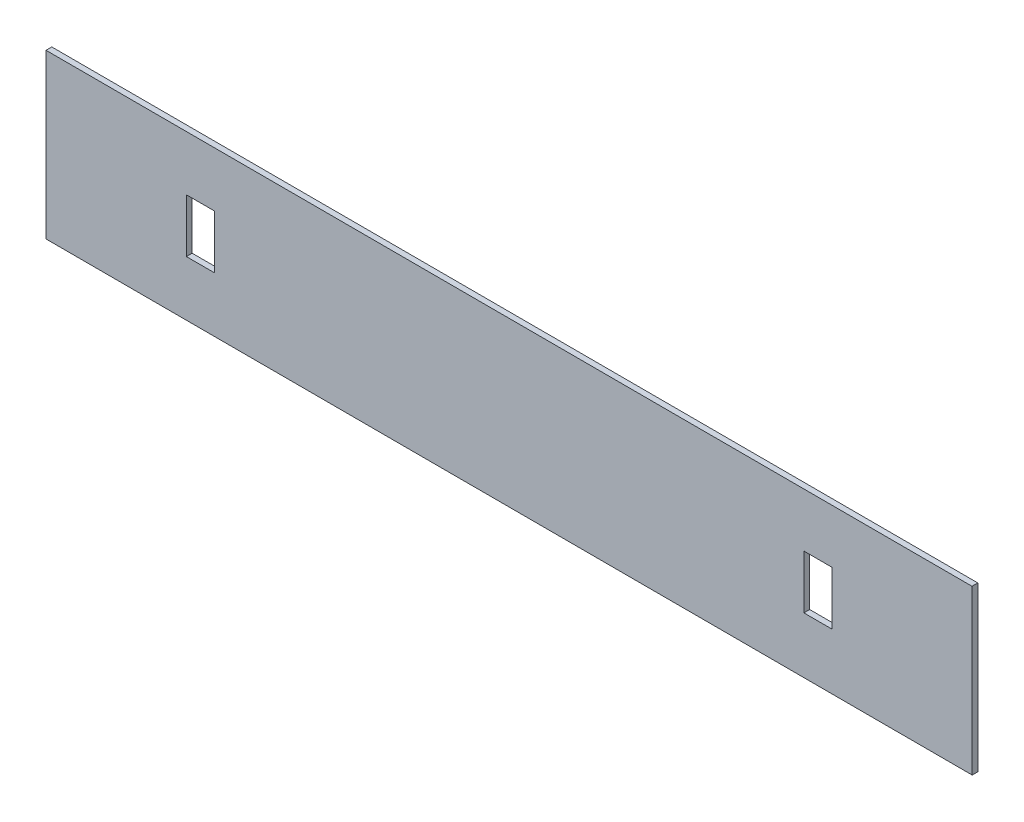
ISO-10303-21;
HEADER;
FILE_DESCRIPTION(('STEP AP214'),'2;1');
FILE_NAME('part.step','',(''),(''),'','','');
FILE_SCHEMA(('AUTOMOTIVE_DESIGN { 1 0 10303 214 1 1 1 1 }'));
ENDSEC;
DATA;
#1=APPLICATION_CONTEXT('core data for automotive mechanical design processes');
#2=APPLICATION_PROTOCOL_DEFINITION('international standard','automotive_design',2000,#1);
#3=PRODUCT_CONTEXT('',#1,'mechanical');
#4=PRODUCT('Part','Part','',(#3));
#5=PRODUCT_RELATED_PRODUCT_CATEGORY('part','',(#4));
#6=PRODUCT_DEFINITION_FORMATION('','',#4);
#7=PRODUCT_DEFINITION_CONTEXT('part definition',#1,'design');
#8=PRODUCT_DEFINITION('design','',#6,#7);
#9=PRODUCT_DEFINITION_SHAPE('','',#8);
#10=(LENGTH_UNIT() NAMED_UNIT(*) SI_UNIT(.MILLI.,.METRE.));
#11=(NAMED_UNIT(*) PLANE_ANGLE_UNIT() SI_UNIT($,.RADIAN.));
#12=(NAMED_UNIT(*) SI_UNIT($,.STERADIAN.) SOLID_ANGLE_UNIT());
#13=UNCERTAINTY_MEASURE_WITH_UNIT(LENGTH_MEASURE(1.E-05),#10,'distance_accuracy_value','');
#14=(GEOMETRIC_REPRESENTATION_CONTEXT(3) GLOBAL_UNCERTAINTY_ASSIGNED_CONTEXT((#13)) GLOBAL_UNIT_ASSIGNED_CONTEXT((#10,
#11,#12)) REPRESENTATION_CONTEXT('',''));
#15=CARTESIAN_POINT('',(0.,0.,0.));
#16=DIRECTION('',(0.,0.,1.));
#17=DIRECTION('',(1.,0.,0.));
#18=AXIS2_PLACEMENT_3D('',#15,#16,#17);
#19=CARTESIAN_POINT('',(0.,0.,3.));
#20=DIRECTION('',(0.,0.,-1.));
#21=DIRECTION('',(-1.,0.,0.));
#22=AXIS2_PLACEMENT_3D('',#19,#20,#21);
#23=PLANE('',#22);
#24=DIRECTION('',(0.,-1.,0.));
#25=VECTOR('',#24,1.);
#26=CARTESIAN_POINT('',(83.1689321677116,1003.49421292878,3.));
#27=LINE('',#26,#25);
#28=CARTESIAN_POINT('',(83.1689321677116,1031.19169713429,3.));
#29=VERTEX_POINT('',#28);
#30=CARTESIAN_POINT('',(83.1689321677116,1003.49421292878,3.));
#31=VERTEX_POINT('',#30);
#32=EDGE_CURVE('E158',#29,#31,#27,.T.);
#33=ORIENTED_EDGE('',*,*,#32,.F.);
#34=DIRECTION('',(-1.,0.,0.));
#35=VECTOR('',#34,1.);
#36=CARTESIAN_POINT('',(83.1689321677116,1031.19169713429,3.));
#37=LINE('',#36,#35);
#38=CARTESIAN_POINT('',(97.688810107722,1031.19169713429,3.));
#39=VERTEX_POINT('',#38);
#40=EDGE_CURVE('E166',#39,#29,#37,.T.);
#41=ORIENTED_EDGE('',*,*,#40,.F.);
#42=DIRECTION('',(0.,1.,0.));
#43=VECTOR('',#42,1.);
#44=CARTESIAN_POINT('',(97.688810107722,1031.19169713429,3.));
#45=LINE('',#44,#43);
#46=CARTESIAN_POINT('',(97.688810107722,1003.49421292878,3.));
#47=VERTEX_POINT('',#46);
#48=EDGE_CURVE('E163',#47,#39,#45,.T.);
#49=ORIENTED_EDGE('',*,*,#48,.F.);
#50=DIRECTION('',(1.,0.,0.));
#51=VECTOR('',#50,1.);
#52=CARTESIAN_POINT('',(97.688810107722,1003.49421292878,3.));
#53=LINE('',#52,#51);
#54=EDGE_CURVE('E160',#31,#47,#53,.T.);
#55=ORIENTED_EDGE('',*,*,#54,.F.);
#56=EDGE_LOOP('',(#33,#41,#49,#55));
#57=FACE_BOUND('',#56,.T.);
#58=DIRECTION('',(0.999999186106853,-0.00127584702502854,0.));
#59=VECTOR('',#58,1.);
#60=CARTESIAN_POINT('',(489.71512013558,974.461884151516,3.));
#61=LINE('',#60,#59);
#62=CARTESIAN_POINT('',(10.6729223978708,975.073069211802,3.));
#63=VERTEX_POINT('',#62);
#64=CARTESIAN_POINT('',(489.71512013558,974.461884151516,3.));
#65=VERTEX_POINT('',#64);
#66=EDGE_CURVE('E189',#63,#65,#61,.T.);
#67=ORIENTED_EDGE('',*,*,#66,.T.);
#68=DIRECTION('',(-0.00126222682662263,0.999999203391402,0.));
#69=VECTOR('',#68,1.);
#70=CARTESIAN_POINT('',(489.60840536891,1059.00665804567,3.));
#71=LINE('',#70,#69);
#72=CARTESIAN_POINT('',(489.60840536891,1059.00665804567,3.));
#73=VERTEX_POINT('',#72);
#74=EDGE_CURVE('E192',#65,#73,#71,.T.);
#75=ORIENTED_EDGE('',*,*,#74,.T.);
#76=DIRECTION('',(-0.999999186106853,0.00127584702502854,0.));
#77=VECTOR('',#76,1.);
#78=CARTESIAN_POINT('',(10.566207631201,1059.61784310596,3.));
#79=LINE('',#78,#77);
#80=CARTESIAN_POINT('',(10.566207631201,1059.61784310596,3.));
#81=VERTEX_POINT('',#80);
#82=EDGE_CURVE('E195',#73,#81,#79,.T.);
#83=ORIENTED_EDGE('',*,*,#82,.T.);
#84=DIRECTION('',(0.00126222682662239,-0.999999203391402,0.));
#85=VECTOR('',#84,1.);
#86=CARTESIAN_POINT('',(10.6729223978708,975.073069211802,3.));
#87=LINE('',#86,#85);
#88=EDGE_CURVE('E197',#81,#63,#87,.T.);
#89=ORIENTED_EDGE('',*,*,#88,.T.);
#90=EDGE_LOOP('',(#67,#75,#83,#89));
#91=FACE_BOUND('',#90,.T.);
#92=DIRECTION('',(-0.00126192411353789,-0.999999203773449,0.));
#93=VECTOR('',#92,1.);
#94=CARTESIAN_POINT('',(402.641037157482,1003.60404679335,3.));
#95=LINE('',#94,#93);
#96=CARTESIAN_POINT('',(402.675989280685,1031.30150894538,3.));
#97=VERTEX_POINT('',#96);
#98=CARTESIAN_POINT('',(402.641037157482,1003.60404679335,3.));
#99=VERTEX_POINT('',#98);
#100=EDGE_CURVE('E122',#97,#99,#95,.T.);
#101=ORIENTED_EDGE('',*,*,#100,.F.);
#102=DIRECTION('',(-0.999999203773449,0.00126192411354345,0.));
#103=VECTOR('',#102,1.);
#104=CARTESIAN_POINT('',(402.675989280685,1031.30150894538,3.));
#105=LINE('',#104,#103);
#106=CARTESIAN_POINT('',(417.195855659583,1031.28318596128,3.));
#107=VERTEX_POINT('',#106);
#108=EDGE_CURVE('E144',#107,#97,#105,.T.);
#109=ORIENTED_EDGE('',*,*,#108,.F.);
#110=DIRECTION('',(0.00126192411353789,0.999999203773449,0.));
#111=VECTOR('',#110,1.);
#112=CARTESIAN_POINT('',(417.195855659583,1031.28318596128,3.));
#113=LINE('',#112,#111);
#114=CARTESIAN_POINT('',(417.16090353638,1003.58572380925,3.));
#115=VERTEX_POINT('',#114);
#116=EDGE_CURVE('E142',#115,#107,#113,.T.);
#117=ORIENTED_EDGE('',*,*,#116,.F.);
#118=DIRECTION('',(0.999999203773449,-0.00126192411354345,0.));
#119=VECTOR('',#118,1.);
#120=CARTESIAN_POINT('',(417.16090353638,1003.58572380925,3.));
#121=LINE('',#120,#119);
#122=EDGE_CURVE('E130',#99,#115,#121,.T.);
#123=ORIENTED_EDGE('',*,*,#122,.F.);
#124=EDGE_LOOP('',(#101,#109,#117,#123));
#125=FACE_BOUND('',#124,.T.);
#126=ADVANCED_FACE('F33',(#57,#91,#125),#23,.F.);
#127=CARTESIAN_POINT('',(0.,0.,0.));
#128=DIRECTION('',(0.,0.,-1.));
#129=DIRECTION('',(-1.,0.,0.));
#130=AXIS2_PLACEMENT_3D('',#127,#128,#129);
#131=PLANE('',#130);
#132=DIRECTION('',(0.999999186106853,-0.00127584702502854,0.));
#133=VECTOR('',#132,1.);
#134=CARTESIAN_POINT('',(489.71512013558,974.461884151516,0.));
#135=LINE('',#134,#133);
#136=CARTESIAN_POINT('',(10.6729223978708,975.073069211802,0.));
#137=VERTEX_POINT('',#136);
#138=CARTESIAN_POINT('',(489.71512013558,974.461884151516,0.));
#139=VERTEX_POINT('',#138);
#140=EDGE_CURVE('E188',#137,#139,#135,.T.);
#141=ORIENTED_EDGE('',*,*,#140,.F.);
#142=DIRECTION('',(0.00126222682662239,-0.999999203391402,0.));
#143=VECTOR('',#142,1.);
#144=CARTESIAN_POINT('',(10.6729223978708,975.073069211802,0.));
#145=LINE('',#144,#143);
#146=CARTESIAN_POINT('',(10.566207631201,1059.61784310596,0.));
#147=VERTEX_POINT('',#146);
#148=EDGE_CURVE('E193',#147,#137,#145,.T.);
#149=ORIENTED_EDGE('',*,*,#148,.F.);
#150=DIRECTION('',(-0.999999186106853,0.00127584702502854,0.));
#151=VECTOR('',#150,1.);
#152=CARTESIAN_POINT('',(10.566207631201,1059.61784310596,0.));
#153=LINE('',#152,#151);
#154=CARTESIAN_POINT('',(489.60840536891,1059.00665804567,0.));
#155=VERTEX_POINT('',#154);
#156=EDGE_CURVE('E204',#155,#147,#153,.T.);
#157=ORIENTED_EDGE('',*,*,#156,.F.);
#158=DIRECTION('',(-0.00126222682662263,0.999999203391402,0.));
#159=VECTOR('',#158,1.);
#160=CARTESIAN_POINT('',(489.60840536891,1059.00665804567,0.));
#161=LINE('',#160,#159);
#162=EDGE_CURVE('E202',#139,#155,#161,.T.);
#163=ORIENTED_EDGE('',*,*,#162,.F.);
#164=EDGE_LOOP('',(#141,#149,#157,#163));
#165=FACE_BOUND('',#164,.T.);
#166=DIRECTION('',(-1.,0.,0.));
#167=VECTOR('',#166,1.);
#168=CARTESIAN_POINT('',(83.1689321677116,1031.19169713429,0.));
#169=LINE('',#168,#167);
#170=CARTESIAN_POINT('',(97.688810107722,1031.19169713429,0.));
#171=VERTEX_POINT('',#170);
#172=CARTESIAN_POINT('',(83.1689321677116,1031.19169713429,0.));
#173=VERTEX_POINT('',#172);
#174=EDGE_CURVE('E161',#171,#173,#169,.T.);
#175=ORIENTED_EDGE('',*,*,#174,.T.);
#176=DIRECTION('',(0.,-1.,0.));
#177=VECTOR('',#176,1.);
#178=CARTESIAN_POINT('',(83.1689321677116,1003.49421292878,0.));
#179=LINE('',#178,#177);
#180=CARTESIAN_POINT('',(83.1689321677116,1003.49421292878,0.));
#181=VERTEX_POINT('',#180);
#182=EDGE_CURVE('E138',#173,#181,#179,.T.);
#183=ORIENTED_EDGE('',*,*,#182,.T.);
#184=DIRECTION('',(1.,0.,0.));
#185=VECTOR('',#184,1.);
#186=CARTESIAN_POINT('',(97.688810107722,1003.49421292878,0.));
#187=LINE('',#186,#185);
#188=CARTESIAN_POINT('',(97.688810107722,1003.49421292878,0.));
#189=VERTEX_POINT('',#188);
#190=EDGE_CURVE('E171',#181,#189,#187,.T.);
#191=ORIENTED_EDGE('',*,*,#190,.T.);
#192=DIRECTION('',(0.,1.,0.));
#193=VECTOR('',#192,1.);
#194=CARTESIAN_POINT('',(97.688810107722,1031.19169713429,0.));
#195=LINE('',#194,#193);
#196=EDGE_CURVE('E174',#189,#171,#195,.T.);
#197=ORIENTED_EDGE('',*,*,#196,.T.);
#198=EDGE_LOOP('',(#175,#183,#191,#197));
#199=FACE_BOUND('',#198,.T.);
#200=DIRECTION('',(-0.999999203773449,0.00126192411354345,0.));
#201=VECTOR('',#200,1.);
#202=CARTESIAN_POINT('',(402.675989280685,1031.30150894538,0.));
#203=LINE('',#202,#201);
#204=CARTESIAN_POINT('',(417.195855659583,1031.28318596128,0.));
#205=VERTEX_POINT('',#204);
#206=CARTESIAN_POINT('',(402.675989280685,1031.30150894538,0.));
#207=VERTEX_POINT('',#206);
#208=EDGE_CURVE('E131',#205,#207,#203,.T.);
#209=ORIENTED_EDGE('',*,*,#208,.T.);
#210=DIRECTION('',(-0.00126192411353789,-0.999999203773449,0.));
#211=VECTOR('',#210,1.);
#212=CARTESIAN_POINT('',(402.641037157482,1003.60404679335,0.));
#213=LINE('',#212,#211);
#214=CARTESIAN_POINT('',(402.641037157482,1003.60404679335,0.));
#215=VERTEX_POINT('',#214);
#216=EDGE_CURVE('E56',#207,#215,#213,.T.);
#217=ORIENTED_EDGE('',*,*,#216,.T.);
#218=DIRECTION('',(0.999999203773449,-0.00126192411354345,0.));
#219=VECTOR('',#218,1.);
#220=CARTESIAN_POINT('',(417.16090353638,1003.58572380925,0.));
#221=LINE('',#220,#219);
#222=CARTESIAN_POINT('',(417.16090353638,1003.58572380925,0.));
#223=VERTEX_POINT('',#222);
#224=EDGE_CURVE('E137',#215,#223,#221,.T.);
#225=ORIENTED_EDGE('',*,*,#224,.T.);
#226=DIRECTION('',(0.00126192411353789,0.999999203773449,0.));
#227=VECTOR('',#226,1.);
#228=CARTESIAN_POINT('',(417.195855659583,1031.28318596128,0.));
#229=LINE('',#228,#227);
#230=EDGE_CURVE('E150',#223,#205,#229,.T.);
#231=ORIENTED_EDGE('',*,*,#230,.T.);
#232=EDGE_LOOP('',(#209,#217,#225,#231));
#233=FACE_BOUND('',#232,.T.);
#234=ADVANCED_FACE('F222',(#165,#199,#233),#131,.T.);
#235=CARTESIAN_POINT('',(489.71512013558,974.461884151516,3.));
#236=DIRECTION('',(0.00127584702502854,0.999999186106853,0.));
#237=DIRECTION('',(-0.999999186106853,0.00127584702502854,0.));
#238=AXIS2_PLACEMENT_3D('',#235,#236,#237);
#239=PLANE('',#238);
#240=ORIENTED_EDGE('',*,*,#140,.T.);
#241=DIRECTION('',(0.,0.,-1.));
#242=VECTOR('',#241,1.);
#243=CARTESIAN_POINT('',(489.71512013558,974.461884151516,3.));
#244=LINE('',#243,#242);
#245=EDGE_CURVE('E11',#65,#139,#244,.T.);
#246=ORIENTED_EDGE('',*,*,#245,.F.);
#247=ORIENTED_EDGE('',*,*,#66,.F.);
#248=DIRECTION('',(0.,0.,-1.));
#249=VECTOR('',#248,1.);
#250=CARTESIAN_POINT('',(10.6729223978708,975.073069211802,3.));
#251=LINE('',#250,#249);
#252=EDGE_CURVE('E199',#63,#137,#251,.T.);
#253=ORIENTED_EDGE('',*,*,#252,.T.);
#254=EDGE_LOOP('',(#240,#246,#247,#253));
#255=FACE_BOUND('',#254,.T.);
#256=ADVANCED_FACE('F35',(#255),#239,.F.);
#257=CARTESIAN_POINT('',(489.60840536891,1059.00665804567,3.));
#258=DIRECTION('',(-0.999999203391402,-0.00126222682662263,0.));
#259=DIRECTION('',(0.00126222682662263,-0.999999203391402,0.));
#260=AXIS2_PLACEMENT_3D('',#257,#258,#259);
#261=PLANE('',#260);
#262=ORIENTED_EDGE('',*,*,#162,.T.);
#263=DIRECTION('',(0.,0.,-1.));
#264=VECTOR('',#263,1.);
#265=CARTESIAN_POINT('',(489.60840536891,1059.00665804567,3.));
#266=LINE('',#265,#264);
#267=EDGE_CURVE('E41',#73,#155,#266,.T.);
#268=ORIENTED_EDGE('',*,*,#267,.F.);
#269=ORIENTED_EDGE('',*,*,#74,.F.);
#270=ORIENTED_EDGE('',*,*,#245,.T.);
#271=EDGE_LOOP('',(#262,#268,#269,#270));
#272=FACE_BOUND('',#271,.T.);
#273=ADVANCED_FACE('F232',(#272),#261,.F.);
#274=CARTESIAN_POINT('',(10.566207631201,1059.61784310596,3.));
#275=DIRECTION('',(-0.00127584702502854,-0.999999186106853,0.));
#276=DIRECTION('',(0.999999186106853,-0.00127584702502854,0.));
#277=AXIS2_PLACEMENT_3D('',#274,#275,#276);
#278=PLANE('',#277);
#279=ORIENTED_EDGE('',*,*,#156,.T.);
#280=DIRECTION('',(0.,0.,-1.));
#281=VECTOR('',#280,1.);
#282=CARTESIAN_POINT('',(10.566207631201,1059.61784310596,3.));
#283=LINE('',#282,#281);
#284=EDGE_CURVE('E209',#81,#147,#283,.T.);
#285=ORIENTED_EDGE('',*,*,#284,.F.);
#286=ORIENTED_EDGE('',*,*,#82,.F.);
#287=ORIENTED_EDGE('',*,*,#267,.T.);
#288=EDGE_LOOP('',(#279,#285,#286,#287));
#289=FACE_BOUND('',#288,.T.);
#290=ADVANCED_FACE('F216',(#289),#278,.F.);
#291=CARTESIAN_POINT('',(10.6729223978708,975.073069211802,3.));
#292=DIRECTION('',(0.999999203391402,0.00126222682662239,0.));
#293=DIRECTION('',(-0.00126222682662239,0.999999203391402,0.));
#294=AXIS2_PLACEMENT_3D('',#291,#292,#293);
#295=PLANE('',#294);
#296=ORIENTED_EDGE('',*,*,#148,.T.);
#297=ORIENTED_EDGE('',*,*,#252,.F.);
#298=ORIENTED_EDGE('',*,*,#88,.F.);
#299=ORIENTED_EDGE('',*,*,#284,.T.);
#300=EDGE_LOOP('',(#296,#297,#298,#299));
#301=FACE_BOUND('',#300,.T.);
#302=ADVANCED_FACE('F226',(#301),#295,.F.);
#303=CARTESIAN_POINT('',(83.1689321677116,1003.49421292878,3.));
#304=DIRECTION('',(1.,0.,0.));
#305=DIRECTION('',(0.,0.,-1.));
#306=AXIS2_PLACEMENT_3D('',#303,#304,#305);
#307=PLANE('',#306);
#308=ORIENTED_EDGE('',*,*,#182,.F.);
#309=DIRECTION('',(0.,0.,-1.));
#310=VECTOR('',#309,1.);
#311=CARTESIAN_POINT('',(83.1689321677116,1031.19169713429,3.));
#312=LINE('',#311,#310);
#313=EDGE_CURVE('E168',#29,#173,#312,.T.);
#314=ORIENTED_EDGE('',*,*,#313,.F.);
#315=ORIENTED_EDGE('',*,*,#32,.T.);
#316=DIRECTION('',(0.,0.,-1.));
#317=VECTOR('',#316,1.);
#318=CARTESIAN_POINT('',(83.1689321677116,1003.49421292878,3.));
#319=LINE('',#318,#317);
#320=EDGE_CURVE('E185',#31,#181,#319,.T.);
#321=ORIENTED_EDGE('',*,*,#320,.T.);
#322=EDGE_LOOP('',(#308,#314,#315,#321));
#323=FACE_BOUND('',#322,.T.);
#324=ADVANCED_FACE('F248',(#323),#307,.T.);
#325=CARTESIAN_POINT('',(97.688810107722,1003.49421292878,3.));
#326=DIRECTION('',(0.,1.,0.));
#327=DIRECTION('',(0.,0.,1.));
#328=AXIS2_PLACEMENT_3D('',#325,#326,#327);
#329=PLANE('',#328);
#330=ORIENTED_EDGE('',*,*,#190,.F.);
#331=ORIENTED_EDGE('',*,*,#320,.F.);
#332=ORIENTED_EDGE('',*,*,#54,.T.);
#333=DIRECTION('',(0.,0.,-1.));
#334=VECTOR('',#333,1.);
#335=CARTESIAN_POINT('',(97.688810107722,1003.49421292878,3.));
#336=LINE('',#335,#334);
#337=EDGE_CURVE('E183',#47,#189,#336,.T.);
#338=ORIENTED_EDGE('',*,*,#337,.T.);
#339=EDGE_LOOP('',(#330,#331,#332,#338));
#340=FACE_BOUND('',#339,.T.);
#341=ADVANCED_FACE('F255',(#340),#329,.T.);
#342=CARTESIAN_POINT('',(97.688810107722,1031.19169713429,3.));
#343=DIRECTION('',(-1.,0.,0.));
#344=DIRECTION('',(0.,0.,1.));
#345=AXIS2_PLACEMENT_3D('',#342,#343,#344);
#346=PLANE('',#345);
#347=ORIENTED_EDGE('',*,*,#196,.F.);
#348=ORIENTED_EDGE('',*,*,#337,.F.);
#349=ORIENTED_EDGE('',*,*,#48,.T.);
#350=DIRECTION('',(0.,0.,-1.));
#351=VECTOR('',#350,1.);
#352=CARTESIAN_POINT('',(97.688810107722,1031.19169713429,3.));
#353=LINE('',#352,#351);
#354=EDGE_CURVE('E181',#39,#171,#353,.T.);
#355=ORIENTED_EDGE('',*,*,#354,.T.);
#356=EDGE_LOOP('',(#347,#348,#349,#355));
#357=FACE_BOUND('',#356,.T.);
#358=ADVANCED_FACE('F260',(#357),#346,.T.);
#359=CARTESIAN_POINT('',(83.1689321677116,1031.19169713429,3.));
#360=DIRECTION('',(0.,-1.,0.));
#361=DIRECTION('',(0.,0.,-1.));
#362=AXIS2_PLACEMENT_3D('',#359,#360,#361);
#363=PLANE('',#362);
#364=ORIENTED_EDGE('',*,*,#174,.F.);
#365=ORIENTED_EDGE('',*,*,#354,.F.);
#366=ORIENTED_EDGE('',*,*,#40,.T.);
#367=ORIENTED_EDGE('',*,*,#313,.T.);
#368=EDGE_LOOP('',(#364,#365,#366,#367));
#369=FACE_BOUND('',#368,.T.);
#370=ADVANCED_FACE('F266',(#369),#363,.T.);
#371=CARTESIAN_POINT('',(402.641037157482,1003.60404679335,3.));
#372=DIRECTION('',(0.999999203773449,-0.00126192411353789,0.));
#373=DIRECTION('',(0.00126192411353789,0.999999203773449,0.));
#374=AXIS2_PLACEMENT_3D('',#371,#372,#373);
#375=PLANE('',#374);
#376=ORIENTED_EDGE('',*,*,#216,.F.);
#377=DIRECTION('',(0.,0.,-1.));
#378=VECTOR('',#377,1.);
#379=CARTESIAN_POINT('',(402.675989280685,1031.30150894538,3.));
#380=LINE('',#379,#378);
#381=EDGE_CURVE('E126',#97,#207,#380,.T.);
#382=ORIENTED_EDGE('',*,*,#381,.F.);
#383=ORIENTED_EDGE('',*,*,#100,.T.);
#384=DIRECTION('',(0.,0.,-1.));
#385=VECTOR('',#384,1.);
#386=CARTESIAN_POINT('',(402.641037157482,1003.60404679335,3.));
#387=LINE('',#386,#385);
#388=EDGE_CURVE('E125',#99,#215,#387,.T.);
#389=ORIENTED_EDGE('',*,*,#388,.T.);
#390=EDGE_LOOP('',(#376,#382,#383,#389));
#391=FACE_BOUND('',#390,.T.);
#392=ADVANCED_FACE('F124',(#391),#375,.T.);
#393=CARTESIAN_POINT('',(417.16090353638,1003.58572380925,3.));
#394=DIRECTION('',(0.00126192411354345,0.999999203773449,0.));
#395=DIRECTION('',(-0.999999203773449,0.00126192411354345,0.));
#396=AXIS2_PLACEMENT_3D('',#393,#394,#395);
#397=PLANE('',#396);
#398=ORIENTED_EDGE('',*,*,#224,.F.);
#399=ORIENTED_EDGE('',*,*,#388,.F.);
#400=ORIENTED_EDGE('',*,*,#122,.T.);
#401=DIRECTION('',(0.,0.,-1.));
#402=VECTOR('',#401,1.);
#403=CARTESIAN_POINT('',(417.16090353638,1003.58572380925,3.));
#404=LINE('',#403,#402);
#405=EDGE_CURVE('E139',#115,#223,#404,.T.);
#406=ORIENTED_EDGE('',*,*,#405,.T.);
#407=EDGE_LOOP('',(#398,#399,#400,#406));
#408=FACE_BOUND('',#407,.T.);
#409=ADVANCED_FACE('F134',(#408),#397,.T.);
#410=CARTESIAN_POINT('',(417.195855659583,1031.28318596128,3.));
#411=DIRECTION('',(-0.999999203773449,0.00126192411353789,0.));
#412=DIRECTION('',(-0.00126192411353789,-0.999999203773449,0.));
#413=AXIS2_PLACEMENT_3D('',#410,#411,#412);
#414=PLANE('',#413);
#415=ORIENTED_EDGE('',*,*,#230,.F.);
#416=ORIENTED_EDGE('',*,*,#405,.F.);
#417=ORIENTED_EDGE('',*,*,#116,.T.);
#418=DIRECTION('',(0.,0.,-1.));
#419=VECTOR('',#418,1.);
#420=CARTESIAN_POINT('',(417.195855659583,1031.28318596128,3.));
#421=LINE('',#420,#419);
#422=EDGE_CURVE('E48',#107,#205,#421,.T.);
#423=ORIENTED_EDGE('',*,*,#422,.T.);
#424=EDGE_LOOP('',(#415,#416,#417,#423));
#425=FACE_BOUND('',#424,.T.);
#426=ADVANCED_FACE('F285',(#425),#414,.T.);
#427=CARTESIAN_POINT('',(402.675989280685,1031.30150894538,3.));
#428=DIRECTION('',(-0.00126192411354345,-0.999999203773449,0.));
#429=DIRECTION('',(0.999999203773449,-0.00126192411354345,0.));
#430=AXIS2_PLACEMENT_3D('',#427,#428,#429);
#431=PLANE('',#430);
#432=ORIENTED_EDGE('',*,*,#208,.F.);
#433=ORIENTED_EDGE('',*,*,#422,.F.);
#434=ORIENTED_EDGE('',*,*,#108,.T.);
#435=ORIENTED_EDGE('',*,*,#381,.T.);
#436=EDGE_LOOP('',(#432,#433,#434,#435));
#437=FACE_BOUND('',#436,.T.);
#438=ADVANCED_FACE('F288',(#437),#431,.T.);
#439=CLOSED_SHELL('',(#126,#234,#256,#273,#290,#302,#324,#341,#358,#370,#392,#409,#426,#438));
#440=MANIFOLD_SOLID_BREP('B2',#439);
#441=ADVANCED_BREP_SHAPE_REPRESENTATION('',(#18,#440),#14);
#442=SHAPE_DEFINITION_REPRESENTATION(#9,#441);
ENDSEC;
END-ISO-10303-21;
